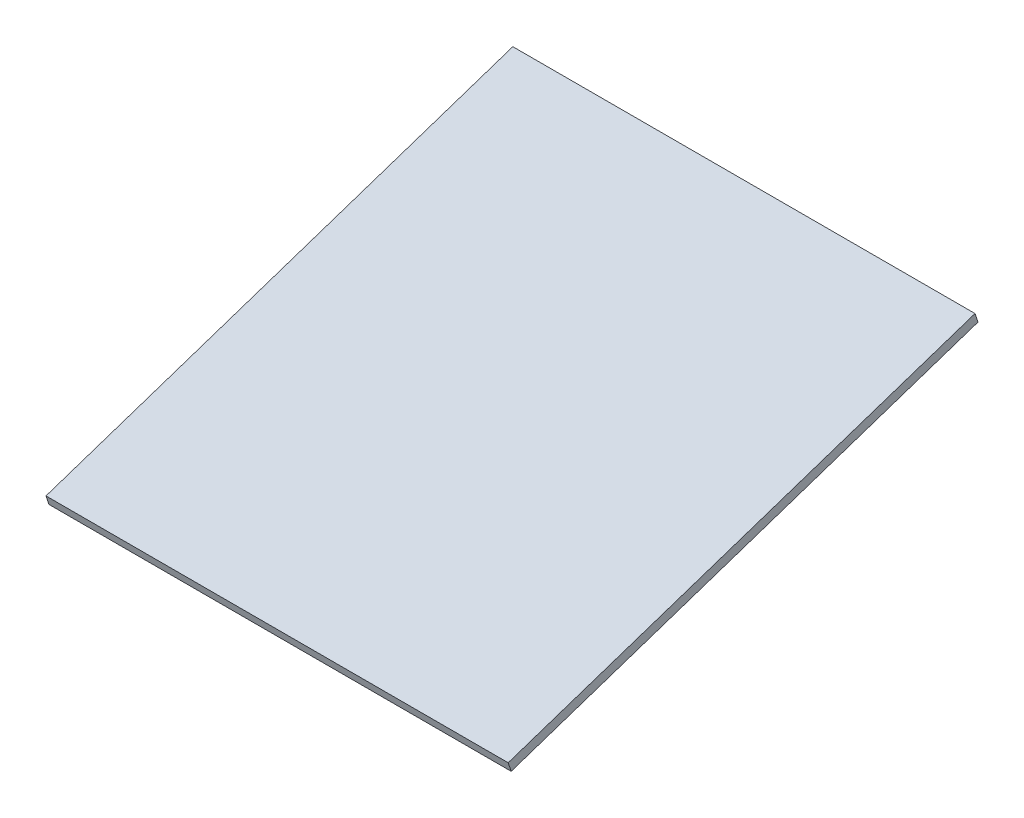
ISO-10303-21;
HEADER;
FILE_DESCRIPTION(('STEP AP214'),'2;1');
FILE_NAME('part.step','',(''),(''),'','','');
FILE_SCHEMA(('AUTOMOTIVE_DESIGN { 1 0 10303 214 1 1 1 1 }'));
ENDSEC;
DATA;
#1=APPLICATION_CONTEXT('core data for automotive mechanical design processes');
#2=APPLICATION_PROTOCOL_DEFINITION('international standard','automotive_design',2000,#1);
#3=PRODUCT_CONTEXT('',#1,'mechanical');
#4=PRODUCT('Part','Part','',(#3));
#5=PRODUCT_RELATED_PRODUCT_CATEGORY('part','',(#4));
#6=PRODUCT_DEFINITION_FORMATION('','',#4);
#7=PRODUCT_DEFINITION_CONTEXT('part definition',#1,'design');
#8=PRODUCT_DEFINITION('design','',#6,#7);
#9=PRODUCT_DEFINITION_SHAPE('','',#8);
#10=(LENGTH_UNIT() NAMED_UNIT(*) SI_UNIT(.MILLI.,.METRE.));
#11=(NAMED_UNIT(*) PLANE_ANGLE_UNIT() SI_UNIT($,.RADIAN.));
#12=(NAMED_UNIT(*) SI_UNIT($,.STERADIAN.) SOLID_ANGLE_UNIT());
#13=UNCERTAINTY_MEASURE_WITH_UNIT(LENGTH_MEASURE(1.E-05),#10,'distance_accuracy_value','');
#14=(GEOMETRIC_REPRESENTATION_CONTEXT(3) GLOBAL_UNCERTAINTY_ASSIGNED_CONTEXT((#13)) GLOBAL_UNIT_ASSIGNED_CONTEXT((#10,
#11,#12)) REPRESENTATION_CONTEXT('',''));
#15=CARTESIAN_POINT('',(0.,0.,0.));
#16=DIRECTION('',(0.,0.,1.));
#17=DIRECTION('',(1.,0.,0.));
#18=AXIS2_PLACEMENT_3D('',#15,#16,#17);
#19=CARTESIAN_POINT('',(140.,1.35,0.450000000000001));
#20=DIRECTION('',(0.,0.948683298050514,0.316227766016838));
#21=DIRECTION('',(0.,-0.316227766016838,0.948683298050514));
#22=AXIS2_PLACEMENT_3D('',#19,#20,#21);
#23=PLANE('',#22);
#24=DIRECTION('',(0.,0.316227766016838,-0.948683298050514));
#25=VECTOR('',#24,1.);
#26=CARTESIAN_POINT('',(0.,1.35,0.450000000000001));
#27=LINE('',#26,#25);
#28=CARTESIAN_POINT('',(0.,-22.2170824512629,71.1512473537885));
#29=VERTEX_POINT('',#28);
#30=CARTESIAN_POINT('',(0.,24.9170824512628,-70.2512473537885));
#31=VERTEX_POINT('',#30);
#32=EDGE_CURVE('E190',#29,#31,#27,.T.);
#33=ORIENTED_EDGE('',*,*,#32,.F.);
#34=DIRECTION('',(-1.,0.,0.));
#35=VECTOR('',#34,1.);
#36=CARTESIAN_POINT('',(140.,-22.2170824512629,71.1512473537885));
#37=LINE('',#36,#35);
#38=CARTESIAN_POINT('',(140.,-22.2170824512629,71.1512473537885));
#39=VERTEX_POINT('',#38);
#40=EDGE_CURVE('E11',#39,#29,#37,.T.);
#41=ORIENTED_EDGE('',*,*,#40,.F.);
#42=DIRECTION('',(0.,0.316227766016838,-0.948683298050514));
#43=VECTOR('',#42,1.);
#44=CARTESIAN_POINT('',(140.,1.35,0.450000000000001));
#45=LINE('',#44,#43);
#46=CARTESIAN_POINT('',(140.,24.9170824512628,-70.2512473537885));
#47=VERTEX_POINT('',#46);
#48=EDGE_CURVE('E191',#39,#47,#45,.T.);
#49=ORIENTED_EDGE('',*,*,#48,.T.);
#50=DIRECTION('',(-1.,0.,0.));
#51=VECTOR('',#50,1.);
#52=CARTESIAN_POINT('',(140.,24.9170824512628,-70.2512473537885));
#53=LINE('',#52,#51);
#54=EDGE_CURVE('E202',#47,#31,#53,.T.);
#55=ORIENTED_EDGE('',*,*,#54,.T.);
#56=EDGE_LOOP('',(#33,#41,#49,#55));
#57=FACE_BOUND('',#56,.T.);
#58=ADVANCED_FACE('F35',(#57),#23,.T.);
#59=CARTESIAN_POINT('',(140.,-23.5670824512628,70.7012473537885));
#60=DIRECTION('',(0.,0.316227766016837,-0.948683298050514));
#61=DIRECTION('',(0.,0.948683298050514,0.316227766016837));
#62=AXIS2_PLACEMENT_3D('',#59,#60,#61);
#63=PLANE('',#62);
#64=DIRECTION('',(0.,-0.948683298050514,-0.316227766016837));
#65=VECTOR('',#64,1.);
#66=CARTESIAN_POINT('',(0.,-23.5670824512628,70.7012473537885));
#67=LINE('',#66,#65);
#68=CARTESIAN_POINT('',(0.,-24.9170824512629,70.2512473537885));
#69=VERTEX_POINT('',#68);
#70=EDGE_CURVE('E205',#29,#69,#67,.T.);
#71=ORIENTED_EDGE('',*,*,#70,.T.);
#72=DIRECTION('',(-1.,0.,0.));
#73=VECTOR('',#72,1.);
#74=CARTESIAN_POINT('',(140.,-24.9170824512629,70.2512473537885));
#75=LINE('',#74,#73);
#76=CARTESIAN_POINT('',(140.,-24.9170824512629,70.2512473537885));
#77=VERTEX_POINT('',#76);
#78=EDGE_CURVE('E42',#77,#69,#75,.T.);
#79=ORIENTED_EDGE('',*,*,#78,.F.);
#80=DIRECTION('',(0.,-0.948683298050514,-0.316227766016837));
#81=VECTOR('',#80,1.);
#82=CARTESIAN_POINT('',(140.,-23.5670824512628,70.7012473537885));
#83=LINE('',#82,#81);
#84=EDGE_CURVE('E194',#39,#77,#83,.T.);
#85=ORIENTED_EDGE('',*,*,#84,.F.);
#86=ORIENTED_EDGE('',*,*,#40,.T.);
#87=EDGE_LOOP('',(#71,#79,#85,#86));
#88=FACE_BOUND('',#87,.T.);
#89=ADVANCED_FACE('F234',(#88),#63,.F.);
#90=CARTESIAN_POINT('',(140.,-1.35,-0.45));
#91=DIRECTION('',(0.,0.948683298050514,0.316227766016838));
#92=DIRECTION('',(0.,-0.316227766016838,0.948683298050514));
#93=AXIS2_PLACEMENT_3D('',#90,#91,#92);
#94=PLANE('',#93);
#95=DIRECTION('',(-1.,0.,0.));
#96=VECTOR('',#95,1.);
#97=CARTESIAN_POINT('',(127.,-14.7170824512628,39.6512473537885));
#98=LINE('',#97,#96);
#99=CARTESIAN_POINT('',(127.,-14.7170824512628,39.6512473537885));
#100=VERTEX_POINT('',#99);
#101=CARTESIAN_POINT('',(119.,-14.7170824512628,39.6512473537885));
#102=VERTEX_POINT('',#101);
#103=EDGE_CURVE('E49',#100,#102,#98,.T.);
#104=ORIENTED_EDGE('',*,*,#103,.F.);
#105=DIRECTION('',(0.,0.316227766016838,-0.948683298050514));
#106=VECTOR('',#105,1.);
#107=CARTESIAN_POINT('',(127.,-1.35,-0.45));
#108=LINE('',#107,#106);
#109=CARTESIAN_POINT('',(127.,17.6162508820705,-57.3487526462115));
#110=VERTEX_POINT('',#109);
#111=EDGE_CURVE('E54',#100,#110,#108,.T.);
#112=ORIENTED_EDGE('',*,*,#111,.T.);
#113=DIRECTION('',(-1.,0.,0.));
#114=VECTOR('',#113,1.);
#115=CARTESIAN_POINT('',(127.,17.6162508820705,-57.3487526462115));
#116=LINE('',#115,#114);
#117=CARTESIAN_POINT('',(119.,17.6162508820705,-57.3487526462115));
#118=VERTEX_POINT('',#117);
#119=EDGE_CURVE('E156',#110,#118,#116,.T.);
#120=ORIENTED_EDGE('',*,*,#119,.T.);
#121=DIRECTION('',(0.,0.316227766016838,-0.948683298050514));
#122=VECTOR('',#121,1.);
#123=CARTESIAN_POINT('',(119.,-1.35,-0.45));
#124=LINE('',#123,#122);
#125=EDGE_CURVE('E139',#102,#118,#124,.T.);
#126=ORIENTED_EDGE('',*,*,#125,.F.);
#127=EDGE_LOOP('',(#104,#112,#120,#126));
#128=FACE_BOUND('',#127,.T.);
#129=DIRECTION('',(-1.,0.,0.));
#130=VECTOR('',#129,1.);
#131=CARTESIAN_POINT('',(21.3,-14.7170824512628,39.6512473537885));
#132=LINE('',#131,#130);
#133=CARTESIAN_POINT('',(21.3,-14.7170824512628,39.6512473537885));
#134=VERTEX_POINT('',#133);
#135=CARTESIAN_POINT('',(13.3,-14.7170824512628,39.6512473537885));
#136=VERTEX_POINT('',#135);
#137=EDGE_CURVE('E171',#134,#136,#132,.T.);
#138=ORIENTED_EDGE('',*,*,#137,.F.);
#139=DIRECTION('',(0.,0.316227766016838,-0.948683298050514));
#140=VECTOR('',#139,1.);
#141=CARTESIAN_POINT('',(21.3,-1.35,-0.45));
#142=LINE('',#141,#140);
#143=CARTESIAN_POINT('',(21.3,17.6162508820705,-57.3487526462115));
#144=VERTEX_POINT('',#143);
#145=EDGE_CURVE('E169',#134,#144,#142,.T.);
#146=ORIENTED_EDGE('',*,*,#145,.T.);
#147=DIRECTION('',(-1.,0.,0.));
#148=VECTOR('',#147,1.);
#149=CARTESIAN_POINT('',(21.3,17.6162508820705,-57.3487526462115));
#150=LINE('',#149,#148);
#151=CARTESIAN_POINT('',(13.3,17.6162508820705,-57.3487526462115));
#152=VERTEX_POINT('',#151);
#153=EDGE_CURVE('E184',#144,#152,#150,.T.);
#154=ORIENTED_EDGE('',*,*,#153,.T.);
#155=DIRECTION('',(0.,0.316227766016838,-0.948683298050514));
#156=VECTOR('',#155,1.);
#157=CARTESIAN_POINT('',(13.3,-1.35,-0.45));
#158=LINE('',#157,#156);
#159=EDGE_CURVE('E163',#136,#152,#158,.T.);
#160=ORIENTED_EDGE('',*,*,#159,.F.);
#161=EDGE_LOOP('',(#138,#146,#154,#160));
#162=FACE_BOUND('',#161,.T.);
#163=DIRECTION('',(0.,0.316227766016838,-0.948683298050514));
#164=VECTOR('',#163,1.);
#165=CARTESIAN_POINT('',(0.,-1.35,-0.45));
#166=LINE('',#165,#164);
#167=CARTESIAN_POINT('',(0.,22.2170824512629,-71.1512473537885));
#168=VERTEX_POINT('',#167);
#169=EDGE_CURVE('E207',#69,#168,#166,.T.);
#170=ORIENTED_EDGE('',*,*,#169,.T.);
#171=DIRECTION('',(-1.,0.,0.));
#172=VECTOR('',#171,1.);
#173=CARTESIAN_POINT('',(140.,22.2170824512629,-71.1512473537885));
#174=LINE('',#173,#172);
#175=CARTESIAN_POINT('',(140.,22.2170824512629,-71.1512473537885));
#176=VERTEX_POINT('',#175);
#177=EDGE_CURVE('E213',#176,#168,#174,.T.);
#178=ORIENTED_EDGE('',*,*,#177,.F.);
#179=DIRECTION('',(0.,0.316227766016838,-0.948683298050514));
#180=VECTOR('',#179,1.);
#181=CARTESIAN_POINT('',(140.,-1.35,-0.45));
#182=LINE('',#181,#180);
#183=EDGE_CURVE('E197',#77,#176,#182,.T.);
#184=ORIENTED_EDGE('',*,*,#183,.F.);
#185=ORIENTED_EDGE('',*,*,#78,.T.);
#186=EDGE_LOOP('',(#170,#178,#184,#185));
#187=FACE_BOUND('',#186,.T.);
#188=ADVANCED_FACE('F219',(#128,#162,#187),#94,.F.);
#189=CARTESIAN_POINT('',(140.,23.5670824512631,-70.7012473537884));
#190=DIRECTION('',(0.,0.316227766016842,-0.948683298050513));
#191=DIRECTION('',(0.,0.948683298050513,0.316227766016842));
#192=AXIS2_PLACEMENT_3D('',#189,#190,#191);
#193=PLANE('',#192);
#194=DIRECTION('',(0.,-0.948683298050513,-0.316227766016842));
#195=VECTOR('',#194,1.);
#196=CARTESIAN_POINT('',(0.,23.5670824512631,-70.7012473537884));
#197=LINE('',#196,#195);
#198=EDGE_CURVE('E195',#31,#168,#197,.T.);
#199=ORIENTED_EDGE('',*,*,#198,.F.);
#200=ORIENTED_EDGE('',*,*,#54,.F.);
#201=DIRECTION('',(0.,-0.948683298050513,-0.316227766016842));
#202=VECTOR('',#201,1.);
#203=CARTESIAN_POINT('',(140.,23.5670824512631,-70.7012473537884));
#204=LINE('',#203,#202);
#205=EDGE_CURVE('E199',#47,#176,#204,.T.);
#206=ORIENTED_EDGE('',*,*,#205,.T.);
#207=ORIENTED_EDGE('',*,*,#177,.T.);
#208=EDGE_LOOP('',(#199,#200,#206,#207));
#209=FACE_BOUND('',#208,.T.);
#210=ADVANCED_FACE('F229',(#209),#193,.T.);
#211=CARTESIAN_POINT('',(140.,0.,0.));
#212=DIRECTION('',(1.,0.,0.));
#213=DIRECTION('',(0.,0.,-1.));
#214=AXIS2_PLACEMENT_3D('',#211,#212,#213);
#215=PLANE('',#214);
#216=ORIENTED_EDGE('',*,*,#48,.F.);
#217=ORIENTED_EDGE('',*,*,#84,.T.);
#218=ORIENTED_EDGE('',*,*,#183,.T.);
#219=ORIENTED_EDGE('',*,*,#205,.F.);
#220=EDGE_LOOP('',(#216,#217,#218,#219));
#221=FACE_BOUND('',#220,.T.);
#222=ADVANCED_FACE('F233',(#221),#215,.T.);
#223=CARTESIAN_POINT('',(0.,0.,0.));
#224=DIRECTION('',(1.,0.,0.));
#225=DIRECTION('',(0.,0.,-1.));
#226=AXIS2_PLACEMENT_3D('',#223,#224,#225);
#227=PLANE('',#226);
#228=ORIENTED_EDGE('',*,*,#32,.T.);
#229=ORIENTED_EDGE('',*,*,#198,.T.);
#230=ORIENTED_EDGE('',*,*,#169,.F.);
#231=ORIENTED_EDGE('',*,*,#70,.F.);
#232=EDGE_LOOP('',(#228,#229,#230,#231));
#233=FACE_BOUND('',#232,.T.);
#234=ADVANCED_FACE('F225',(#233),#227,.F.);
#235=CARTESIAN_POINT('',(21.3,0.,39.6512473537885));
#236=DIRECTION('',(0.,0.,1.));
#237=DIRECTION('',(1.,0.,0.));
#238=AXIS2_PLACEMENT_3D('',#235,#236,#237);
#239=PLANE('',#238);
#240=DIRECTION('',(0.,1.,0.));
#241=VECTOR('',#240,1.);
#242=CARTESIAN_POINT('',(13.3,0.,39.6512473537885));
#243=LINE('',#242,#241);
#244=CARTESIAN_POINT('',(13.3,-22.7170824512628,39.6512473537885));
#245=VERTEX_POINT('',#244);
#246=EDGE_CURVE('E130',#245,#136,#243,.T.);
#247=ORIENTED_EDGE('',*,*,#246,.F.);
#248=DIRECTION('',(-1.,0.,0.));
#249=VECTOR('',#248,1.);
#250=CARTESIAN_POINT('',(21.3,-22.7170824512628,39.6512473537885));
#251=LINE('',#250,#249);
#252=CARTESIAN_POINT('',(21.3,-22.7170824512628,39.6512473537885));
#253=VERTEX_POINT('',#252);
#254=EDGE_CURVE('E188',#253,#245,#251,.T.);
#255=ORIENTED_EDGE('',*,*,#254,.F.);
#256=DIRECTION('',(0.,1.,0.));
#257=VECTOR('',#256,1.);
#258=CARTESIAN_POINT('',(21.3,0.,39.6512473537885));
#259=LINE('',#258,#257);
#260=EDGE_CURVE('E159',#253,#134,#259,.T.);
#261=ORIENTED_EDGE('',*,*,#260,.T.);
#262=ORIENTED_EDGE('',*,*,#137,.T.);
#263=EDGE_LOOP('',(#247,#255,#261,#262));
#264=FACE_BOUND('',#263,.T.);
#265=ADVANCED_FACE('F249',(#264),#239,.T.);
#266=CARTESIAN_POINT('',(21.3,-8.55,-2.85));
#267=DIRECTION('',(0.,-0.948683298050514,-0.316227766016838));
#268=DIRECTION('',(0.,0.316227766016838,-0.948683298050514));
#269=AXIS2_PLACEMENT_3D('',#266,#267,#268);
#270=PLANE('',#269);
#271=DIRECTION('',(0.,-0.316227766016838,0.948683298050514));
#272=VECTOR('',#271,1.);
#273=CARTESIAN_POINT('',(13.3,-8.55,-2.85));
#274=LINE('',#273,#272);
#275=CARTESIAN_POINT('',(13.3,9.6162508820705,-57.3487526462115));
#276=VERTEX_POINT('',#275);
#277=EDGE_CURVE('E174',#276,#245,#274,.T.);
#278=ORIENTED_EDGE('',*,*,#277,.F.);
#279=DIRECTION('',(-1.,0.,0.));
#280=VECTOR('',#279,1.);
#281=CARTESIAN_POINT('',(21.3,9.6162508820705,-57.3487526462115));
#282=LINE('',#281,#280);
#283=CARTESIAN_POINT('',(21.3,9.6162508820705,-57.3487526462115));
#284=VERTEX_POINT('',#283);
#285=EDGE_CURVE('E186',#284,#276,#282,.T.);
#286=ORIENTED_EDGE('',*,*,#285,.F.);
#287=DIRECTION('',(0.,-0.316227766016838,0.948683298050514));
#288=VECTOR('',#287,1.);
#289=CARTESIAN_POINT('',(21.3,-8.55,-2.85));
#290=LINE('',#289,#288);
#291=EDGE_CURVE('E162',#284,#253,#290,.T.);
#292=ORIENTED_EDGE('',*,*,#291,.T.);
#293=ORIENTED_EDGE('',*,*,#254,.T.);
#294=EDGE_LOOP('',(#278,#286,#292,#293));
#295=FACE_BOUND('',#294,.T.);
#296=ADVANCED_FACE('F254',(#295),#270,.T.);
#297=CARTESIAN_POINT('',(21.3,0.,-57.3487526462115));
#298=DIRECTION('',(0.,0.,-1.));
#299=DIRECTION('',(-1.,0.,0.));
#300=AXIS2_PLACEMENT_3D('',#297,#298,#299);
#301=PLANE('',#300);
#302=DIRECTION('',(0.,-1.,0.));
#303=VECTOR('',#302,1.);
#304=CARTESIAN_POINT('',(13.3,0.,-57.3487526462115));
#305=LINE('',#304,#303);
#306=EDGE_CURVE('E177',#152,#276,#305,.T.);
#307=ORIENTED_EDGE('',*,*,#306,.F.);
#308=ORIENTED_EDGE('',*,*,#153,.F.);
#309=DIRECTION('',(0.,-1.,0.));
#310=VECTOR('',#309,1.);
#311=CARTESIAN_POINT('',(21.3,0.,-57.3487526462115));
#312=LINE('',#311,#310);
#313=EDGE_CURVE('E166',#144,#284,#312,.T.);
#314=ORIENTED_EDGE('',*,*,#313,.T.);
#315=ORIENTED_EDGE('',*,*,#285,.T.);
#316=EDGE_LOOP('',(#307,#308,#314,#315));
#317=FACE_BOUND('',#316,.T.);
#318=ADVANCED_FACE('F258',(#317),#301,.T.);
#319=CARTESIAN_POINT('',(21.3,0.,0.));
#320=DIRECTION('',(1.,0.,0.));
#321=DIRECTION('',(0.,0.,-1.));
#322=AXIS2_PLACEMENT_3D('',#319,#320,#321);
#323=PLANE('',#322);
#324=ORIENTED_EDGE('',*,*,#260,.F.);
#325=ORIENTED_EDGE('',*,*,#291,.F.);
#326=ORIENTED_EDGE('',*,*,#313,.F.);
#327=ORIENTED_EDGE('',*,*,#145,.F.);
#328=EDGE_LOOP('',(#324,#325,#326,#327));
#329=FACE_BOUND('',#328,.T.);
#330=ADVANCED_FACE('F262',(#329),#323,.T.);
#331=CARTESIAN_POINT('',(13.3,0.,0.));
#332=DIRECTION('',(1.,0.,0.));
#333=DIRECTION('',(0.,0.,-1.));
#334=AXIS2_PLACEMENT_3D('',#331,#332,#333);
#335=PLANE('',#334);
#336=ORIENTED_EDGE('',*,*,#246,.T.);
#337=ORIENTED_EDGE('',*,*,#159,.T.);
#338=ORIENTED_EDGE('',*,*,#306,.T.);
#339=ORIENTED_EDGE('',*,*,#277,.T.);
#340=EDGE_LOOP('',(#336,#337,#338,#339));
#341=FACE_BOUND('',#340,.T.);
#342=ADVANCED_FACE('F264',(#341),#335,.F.);
#343=CARTESIAN_POINT('',(127.,0.,39.6512473537885));
#344=DIRECTION('',(0.,0.,1.));
#345=DIRECTION('',(1.,0.,0.));
#346=AXIS2_PLACEMENT_3D('',#343,#344,#345);
#347=PLANE('',#346);
#348=DIRECTION('',(0.,1.,0.));
#349=VECTOR('',#348,1.);
#350=CARTESIAN_POINT('',(119.,0.,39.6512473537885));
#351=LINE('',#350,#349);
#352=CARTESIAN_POINT('',(119.,-22.7170824512628,39.6512473537885));
#353=VERTEX_POINT('',#352);
#354=EDGE_CURVE('E125',#353,#102,#351,.T.);
#355=ORIENTED_EDGE('',*,*,#354,.F.);
#356=DIRECTION('',(-1.,0.,0.));
#357=VECTOR('',#356,1.);
#358=CARTESIAN_POINT('',(127.,-22.7170824512628,39.6512473537885));
#359=LINE('',#358,#357);
#360=CARTESIAN_POINT('',(127.,-22.7170824512628,39.6512473537885));
#361=VERTEX_POINT('',#360);
#362=EDGE_CURVE('E120',#361,#353,#359,.T.);
#363=ORIENTED_EDGE('',*,*,#362,.F.);
#364=DIRECTION('',(0.,1.,0.));
#365=VECTOR('',#364,1.);
#366=CARTESIAN_POINT('',(127.,0.,39.6512473537885));
#367=LINE('',#366,#365);
#368=EDGE_CURVE('E123',#361,#100,#367,.T.);
#369=ORIENTED_EDGE('',*,*,#368,.T.);
#370=ORIENTED_EDGE('',*,*,#103,.T.);
#371=EDGE_LOOP('',(#355,#363,#369,#370));
#372=FACE_BOUND('',#371,.T.);
#373=ADVANCED_FACE('F122',(#372),#347,.T.);
#374=CARTESIAN_POINT('',(127.,-8.55,-2.85));
#375=DIRECTION('',(0.,-0.948683298050514,-0.316227766016838));
#376=DIRECTION('',(0.,0.316227766016838,-0.948683298050514));
#377=AXIS2_PLACEMENT_3D('',#374,#375,#376);
#378=PLANE('',#377);
#379=DIRECTION('',(0.,-0.316227766016838,0.948683298050514));
#380=VECTOR('',#379,1.);
#381=CARTESIAN_POINT('',(119.,-8.55,-2.85));
#382=LINE('',#381,#380);
#383=CARTESIAN_POINT('',(119.,9.6162508820705,-57.3487526462115));
#384=VERTEX_POINT('',#383);
#385=EDGE_CURVE('E148',#384,#353,#382,.T.);
#386=ORIENTED_EDGE('',*,*,#385,.F.);
#387=DIRECTION('',(-1.,0.,0.));
#388=VECTOR('',#387,1.);
#389=CARTESIAN_POINT('',(127.,9.6162508820705,-57.3487526462115));
#390=LINE('',#389,#388);
#391=CARTESIAN_POINT('',(127.,9.6162508820705,-57.3487526462115));
#392=VERTEX_POINT('',#391);
#393=EDGE_CURVE('E131',#392,#384,#390,.T.);
#394=ORIENTED_EDGE('',*,*,#393,.F.);
#395=DIRECTION('',(0.,-0.316227766016838,0.948683298050514));
#396=VECTOR('',#395,1.);
#397=CARTESIAN_POINT('',(127.,-8.55,-2.85));
#398=LINE('',#397,#396);
#399=EDGE_CURVE('E137',#392,#361,#398,.T.);
#400=ORIENTED_EDGE('',*,*,#399,.T.);
#401=ORIENTED_EDGE('',*,*,#362,.T.);
#402=EDGE_LOOP('',(#386,#394,#400,#401));
#403=FACE_BOUND('',#402,.T.);
#404=ADVANCED_FACE('F141',(#403),#378,.T.);
#405=CARTESIAN_POINT('',(127.,0.,-57.3487526462115));
#406=DIRECTION('',(0.,0.,-1.));
#407=DIRECTION('',(-1.,0.,0.));
#408=AXIS2_PLACEMENT_3D('',#405,#406,#407);
#409=PLANE('',#408);
#410=DIRECTION('',(0.,-1.,0.));
#411=VECTOR('',#410,1.);
#412=CARTESIAN_POINT('',(119.,0.,-57.3487526462115));
#413=LINE('',#412,#411);
#414=EDGE_CURVE('E150',#118,#384,#413,.T.);
#415=ORIENTED_EDGE('',*,*,#414,.F.);
#416=ORIENTED_EDGE('',*,*,#119,.F.);
#417=DIRECTION('',(0.,-1.,0.));
#418=VECTOR('',#417,1.);
#419=CARTESIAN_POINT('',(127.,0.,-57.3487526462115));
#420=LINE('',#419,#418);
#421=EDGE_CURVE('E142',#110,#392,#420,.T.);
#422=ORIENTED_EDGE('',*,*,#421,.T.);
#423=ORIENTED_EDGE('',*,*,#393,.T.);
#424=EDGE_LOOP('',(#415,#416,#422,#423));
#425=FACE_BOUND('',#424,.T.);
#426=ADVANCED_FACE('F275',(#425),#409,.T.);
#427=CARTESIAN_POINT('',(127.,0.,0.));
#428=DIRECTION('',(1.,0.,0.));
#429=DIRECTION('',(0.,0.,-1.));
#430=AXIS2_PLACEMENT_3D('',#427,#428,#429);
#431=PLANE('',#430);
#432=ORIENTED_EDGE('',*,*,#368,.F.);
#433=ORIENTED_EDGE('',*,*,#399,.F.);
#434=ORIENTED_EDGE('',*,*,#421,.F.);
#435=ORIENTED_EDGE('',*,*,#111,.F.);
#436=EDGE_LOOP('',(#432,#433,#434,#435));
#437=FACE_BOUND('',#436,.T.);
#438=ADVANCED_FACE('F135',(#437),#431,.T.);
#439=CARTESIAN_POINT('',(119.,0.,0.));
#440=DIRECTION('',(1.,0.,0.));
#441=DIRECTION('',(0.,0.,-1.));
#442=AXIS2_PLACEMENT_3D('',#439,#440,#441);
#443=PLANE('',#442);
#444=ORIENTED_EDGE('',*,*,#354,.T.);
#445=ORIENTED_EDGE('',*,*,#125,.T.);
#446=ORIENTED_EDGE('',*,*,#414,.T.);
#447=ORIENTED_EDGE('',*,*,#385,.T.);
#448=EDGE_LOOP('',(#444,#445,#446,#447));
#449=FACE_BOUND('',#448,.T.);
#450=ADVANCED_FACE('F279',(#449),#443,.F.);
#451=CLOSED_SHELL('',(#58,#89,#188,#210,#222,#234,#265,#296,#318,#330,#342,#373,#404,#426,#438,#450));
#452=MANIFOLD_SOLID_BREP('B2',#451);
#453=ADVANCED_BREP_SHAPE_REPRESENTATION('',(#18,#452),#14);
#454=SHAPE_DEFINITION_REPRESENTATION(#9,#453);
ENDSEC;
END-ISO-10303-21;
